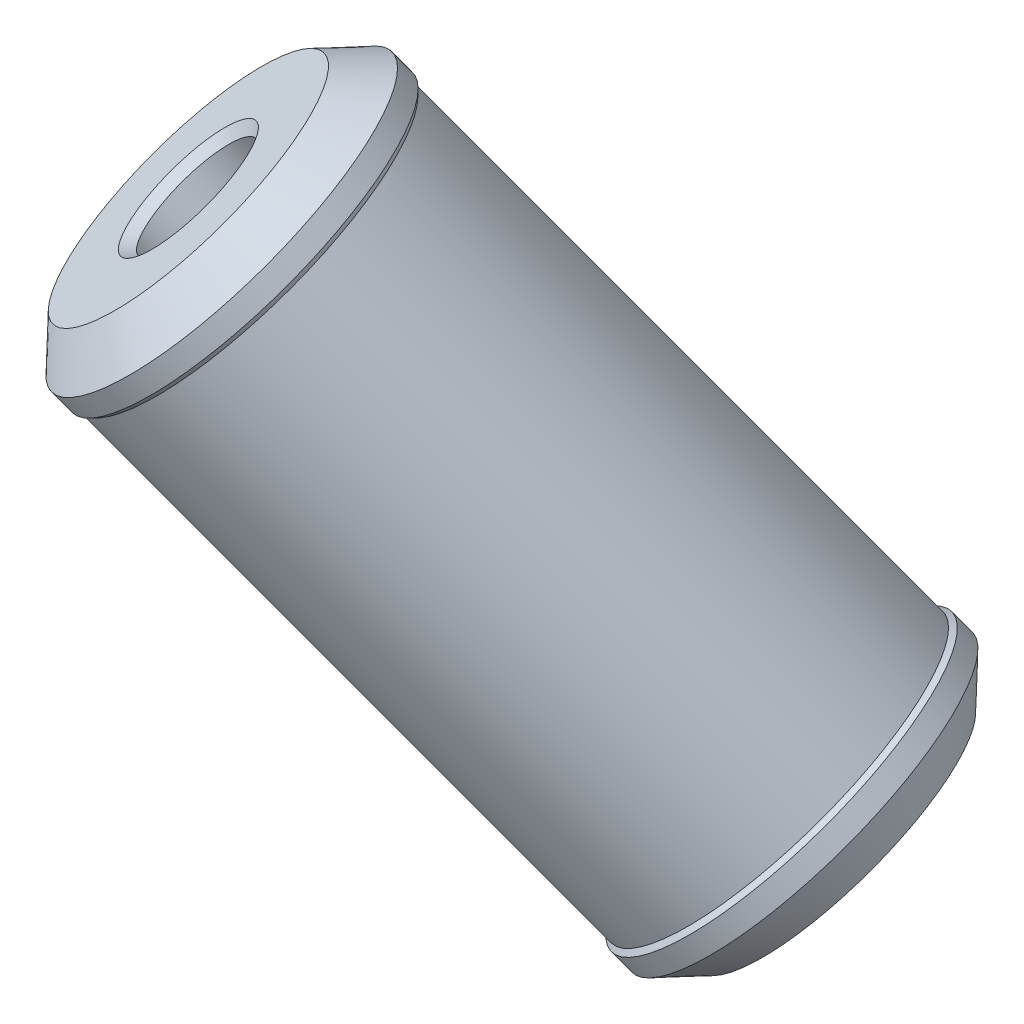
ISO-10303-21;
HEADER;
FILE_DESCRIPTION(('STEP AP214'),'2;1');
FILE_NAME('part.step','',(''),(''),'','','');
FILE_SCHEMA(('AUTOMOTIVE_DESIGN { 1 0 10303 214 1 1 1 1 }'));
ENDSEC;
DATA;
#1=APPLICATION_CONTEXT('core data for automotive mechanical design processes');
#2=APPLICATION_PROTOCOL_DEFINITION('international standard','automotive_design',2000,#1);
#3=PRODUCT_CONTEXT('',#1,'mechanical');
#4=PRODUCT('Part','Part','',(#3));
#5=PRODUCT_RELATED_PRODUCT_CATEGORY('part','',(#4));
#6=PRODUCT_DEFINITION_FORMATION('','',#4);
#7=PRODUCT_DEFINITION_CONTEXT('part definition',#1,'design');
#8=PRODUCT_DEFINITION('design','',#6,#7);
#9=PRODUCT_DEFINITION_SHAPE('','',#8);
#10=(LENGTH_UNIT() NAMED_UNIT(*) SI_UNIT(.MILLI.,.METRE.));
#11=(NAMED_UNIT(*) PLANE_ANGLE_UNIT() SI_UNIT($,.RADIAN.));
#12=(NAMED_UNIT(*) SI_UNIT($,.STERADIAN.) SOLID_ANGLE_UNIT());
#13=UNCERTAINTY_MEASURE_WITH_UNIT(LENGTH_MEASURE(1.E-05),#10,'distance_accuracy_value','');
#14=(GEOMETRIC_REPRESENTATION_CONTEXT(3) GLOBAL_UNCERTAINTY_ASSIGNED_CONTEXT((#13)) GLOBAL_UNIT_ASSIGNED_CONTEXT((#10,
#11,#12)) REPRESENTATION_CONTEXT('',''));
#15=CARTESIAN_POINT('',(0.,0.,0.));
#16=DIRECTION('',(0.,0.,1.));
#17=DIRECTION('',(1.,0.,0.));
#18=AXIS2_PLACEMENT_3D('',#15,#16,#17);
#19=CARTESIAN_POINT('',(-2.64501130833047,-7.85772410593551,-20.2967421844936));
#20=DIRECTION('',(0.612372435695795,-0.707106781186548,-0.353553390593274));
#21=DIRECTION('',(0.612372435695795,0.707106781186548,-0.353553390593274));
#22=AXIS2_PLACEMENT_3D('',#19,#20,#21);
#23=CONICAL_SURFACE('',#22,2.25,0.785398163397453);
#24=CARTESIAN_POINT('',(-2.82872303903921,-7.64559207157955,-20.1906761673156));
#25=DIRECTION('',(0.612372435695795,-0.707106781186548,-0.353553390593274));
#26=DIRECTION('',(0.755928946018454,0.654653670707977,0.));
#27=AXIS2_PLACEMENT_3D('',#24,#25,#26);
#28=CIRCLE('',#27,1.95);
#29=CARTESIAN_POINT('',(-1.35466159430322,-6.36901741369899,-20.1906761673156));
#30=VERTEX_POINT('',#29);
#31=EDGE_CURVE('E119',#30,#30,#28,.F.);
#32=ORIENTED_EDGE('',*,*,#31,.T.);
#33=EDGE_LOOP('',(#32));
#34=FACE_BOUND('',#33,.T.);
#35=CARTESIAN_POINT('',(-2.64501130833046,-7.85772410593551,-20.2967421844936));
#36=DIRECTION('',(-0.612372435695795,0.707106781186548,0.353553390593274));
#37=DIRECTION('',(-0.612372435695795,-0.707106781186548,0.353553390593274));
#38=AXIS2_PLACEMENT_3D('',#35,#36,#37);
#39=CIRCLE('',#38,2.25);
#40=CARTESIAN_POINT('',(-4.022849288646,-9.44871436360524,-19.5012470556588));
#41=VERTEX_POINT('',#40);
#42=EDGE_CURVE('E86',#41,#41,#39,.T.);
#43=ORIENTED_EDGE('',*,*,#42,.F.);
#44=EDGE_LOOP('',(#43));
#45=FACE_BOUND('',#44,.T.);
#46=ADVANCED_FACE('F60',(#34,#45),#23,.F.);
#47=CARTESIAN_POINT('',(-15.9488024738216,7.50417071534223,-12.6157947738548));
#48=DIRECTION('',(-0.612372435695795,0.707106781186548,0.353553390593274));
#49=DIRECTION('',(-0.612372435695795,-0.707106781186548,0.353553390593274));
#50=AXIS2_PLACEMENT_3D('',#47,#48,#49);
#51=CONICAL_SURFACE('',#50,1.75,0.785398163397446);
#52=CARTESIAN_POINT('',(-16.0712769609608,7.64559207157954,-12.5450840957361));
#53=DIRECTION('',(-0.612372435695795,0.707106781186548,0.353553390593274));
#54=DIRECTION('',(-0.755928946018454,-0.654653670707977,0.));
#55=AXIS2_PLACEMENT_3D('',#52,#53,#54);
#56=CIRCLE('',#55,1.95);
#57=CARTESIAN_POINT('',(-17.5453384056967,6.36901741369898,-12.5450840957361));
#58=VERTEX_POINT('',#57);
#59=EDGE_CURVE('E115',#58,#58,#56,.F.);
#60=ORIENTED_EDGE('',*,*,#59,.T.);
#61=EDGE_LOOP('',(#60));
#62=FACE_BOUND('',#61,.T.);
#63=CARTESIAN_POINT('',(-16.2549886916695,7.85772410593551,-12.4390180785581));
#64=DIRECTION('',(0.612372435695795,-0.707106781186548,-0.353553390593274));
#65=DIRECTION('',(-0.612372435695795,-0.707106781186548,0.353553390593274));
#66=AXIS2_PLACEMENT_3D('',#63,#64,#65);
#67=CIRCLE('',#66,2.25);
#68=CARTESIAN_POINT('',(-17.632826671985,6.26673384826578,-11.6435229497233));
#69=VERTEX_POINT('',#68);
#70=EDGE_CURVE('E97',#69,#69,#67,.T.);
#71=ORIENTED_EDGE('',*,*,#70,.F.);
#72=EDGE_LOOP('',(#71));
#73=FACE_BOUND('',#72,.T.);
#74=ADVANCED_FACE('F144',(#62,#73),#51,.F.);
#75=CARTESIAN_POINT('',(-3.86975617972206,-6.44351054356241,-19.5896354033071));
#76=DIRECTION('',(-0.612372435695795,0.707106781186548,0.353553390593273));
#77=DIRECTION('',(-0.612372435695795,-0.707106781186547,0.353553390593274));
#78=AXIS2_PLACEMENT_3D('',#75,#76,#77);
#79=CONICAL_SURFACE('',#78,6.5,0.785398163397449);
#80=CARTESIAN_POINT('',(-3.34706361092806,-7.04706393415568,-19.8914120986037));
#81=DIRECTION('',(0.612372435695795,-0.707106781186546,-0.353553390593277));
#82=DIRECTION('',(0.755928946018454,0.654653670707978,0.));
#83=AXIS2_PLACEMENT_3D('',#80,#81,#82);
#84=CIRCLE('',#83,5.64644660940673);
#85=CARTESIAN_POINT('',(0.921248823270245,-3.35059693485094,-19.8914120986037));
#86=VERTEX_POINT('',#85);
#87=EDGE_CURVE('E120',#86,#86,#84,.T.);
#88=ORIENTED_EDGE('',*,*,#87,.T.);
#89=EDGE_LOOP('',(#88));
#90=FACE_BOUND('',#89,.T.);
#91=CARTESIAN_POINT('',(-2.64501130833046,-7.85772410593551,-20.2967421844936));
#92=DIRECTION('',(0.612372435695795,-0.707106781186548,-0.353553390593274));
#93=DIRECTION('',(-0.612372435695795,-0.707106781186548,0.353553390593274));
#94=AXIS2_PLACEMENT_3D('',#91,#92,#93);
#95=CIRCLE('',#94,4.5);
#96=CARTESIAN_POINT('',(-5.40068726896154,-11.039704621275,-18.7057519268239));
#97=VERTEX_POINT('',#96);
#98=EDGE_CURVE('E79',#97,#97,#95,.T.);
#99=ORIENTED_EDGE('',*,*,#98,.F.);
#100=EDGE_LOOP('',(#99));
#101=FACE_BOUND('',#100,.T.);
#102=ADVANCED_FACE('F151',(#90,#101),#79,.T.);
#103=CARTESIAN_POINT('',(-16.2549886916695,7.85772410593551,-12.4390180785581));
#104=DIRECTION('',(0.612372435695795,-0.707106781186548,-0.353553390593274));
#105=DIRECTION('',(0.612372435695795,0.707106781186548,-0.353553390593274));
#106=AXIS2_PLACEMENT_3D('',#103,#104,#105);
#107=CONICAL_SURFACE('',#106,4.5,0.785398163397448);
#108=CARTESIAN_POINT('',(-15.5529363890719,7.04706393415569,-12.844348164448));
#109=DIRECTION('',(-0.612372435695792,0.707106781186549,0.353553390593275));
#110=DIRECTION('',(-0.755928946018456,-0.654653670707975,0.));
#111=AXIS2_PLACEMENT_3D('',#108,#109,#110);
#112=CIRCLE('',#111,5.64644660940672);
#113=CARTESIAN_POINT('',(-19.8212488232702,3.35059693485097,-12.844348164448));
#114=VERTEX_POINT('',#113);
#115=EDGE_CURVE('E70',#114,#114,#112,.T.);
#116=ORIENTED_EDGE('',*,*,#115,.T.);
#117=EDGE_LOOP('',(#116));
#118=FACE_BOUND('',#117,.T.);
#119=CARTESIAN_POINT('',(-16.2549886916695,7.85772410593551,-12.4390180785581));
#120=DIRECTION('',(-0.612372435695795,0.707106781186548,0.353553390593274));
#121=DIRECTION('',(-0.612372435695795,-0.707106781186548,0.353553390593274));
#122=AXIS2_PLACEMENT_3D('',#119,#120,#121);
#123=CIRCLE('',#122,4.5);
#124=CARTESIAN_POINT('',(-19.0106646523006,4.67574359059604,-10.8480278208884));
#125=VERTEX_POINT('',#124);
#126=EDGE_CURVE('E101',#125,#125,#123,.T.);
#127=ORIENTED_EDGE('',*,*,#126,.F.);
#128=EDGE_LOOP('',(#127));
#129=FACE_BOUND('',#128,.T.);
#130=ADVANCED_FACE('F131',(#118,#129),#107,.T.);
#131=CARTESIAN_POINT('',(-2.64501130833046,-7.85772410593551,-20.2967421844936));
#132=DIRECTION('',(-0.612372435695795,0.707106781186548,0.353553390593274));
#133=DIRECTION('',(0.5,0.,0.866025403784439));
#134=AXIS2_PLACEMENT_3D('',#131,#132,#133);
#135=PLANE('',#134);
#136=ORIENTED_EDGE('',*,*,#98,.T.);
#137=EDGE_LOOP('',(#136));
#138=FACE_BOUND('',#137,.T.);
#139=ORIENTED_EDGE('',*,*,#42,.T.);
#140=EDGE_LOOP('',(#139));
#141=FACE_BOUND('',#140,.T.);
#142=ADVANCED_FACE('F210',(#138,#141),#135,.F.);
#143=CARTESIAN_POINT('',(-16.2549886916695,7.85772410593551,-12.4390180785581));
#144=DIRECTION('',(-0.612372435695795,0.707106781186548,0.353553390593274));
#145=DIRECTION('',(0.5,0.,0.866025403784439));
#146=AXIS2_PLACEMENT_3D('',#143,#144,#145);
#147=PLANE('',#146);
#148=ORIENTED_EDGE('',*,*,#126,.T.);
#149=EDGE_LOOP('',(#148));
#150=FACE_BOUND('',#149,.T.);
#151=ORIENTED_EDGE('',*,*,#70,.T.);
#152=EDGE_LOOP('',(#151));
#153=FACE_BOUND('',#152,.T.);
#154=ADVANCED_FACE('F98',(#150,#153),#147,.T.);
#155=CARTESIAN_POINT('',(8.61331894086729,-20.8577241059356,-26.7967421844937));
#156=DIRECTION('',(-0.612372435695794,0.707106781186547,0.353553390593274));
#157=DIRECTION('',(-0.755928946018454,-0.654653670707977,0.));
#158=AXIS2_PLACEMENT_3D('',#155,#156,#157);
#159=CYLINDRICAL_SURFACE('',#158,5.50000000000001);
#160=CARTESIAN_POINT('',(-3.86975617972207,-6.4435105435624,-19.5896354033071));
#161=DIRECTION('',(-0.612372435695795,0.707106781186548,0.353553390593274));
#162=DIRECTION('',(-0.755928946018454,-0.654653670707977,0.));
#163=AXIS2_PLACEMENT_3D('',#160,#161,#162);
#164=CIRCLE('',#163,5.50000000000001);
#165=CARTESIAN_POINT('',(-8.02736538282358,-10.0441057324563,-19.5896354033071));
#166=VERTEX_POINT('',#165);
#167=EDGE_CURVE('E102',#166,#166,#164,.F.);
#168=ORIENTED_EDGE('',*,*,#167,.F.);
#169=EDGE_LOOP('',(#168));
#170=FACE_BOUND('',#169,.T.);
#171=CARTESIAN_POINT('',(-15.0302438202779,6.44351054356243,-13.1461248597447));
#172=DIRECTION('',(-0.612372435695795,0.707106781186548,0.353553390593274));
#173=DIRECTION('',(-0.755928946018454,-0.654653670707977,0.));
#174=AXIS2_PLACEMENT_3D('',#171,#172,#173);
#175=CIRCLE('',#174,5.50000000000001);
#176=CARTESIAN_POINT('',(-19.1878530233794,2.84291535466855,-13.1461248597447));
#177=VERTEX_POINT('',#176);
#178=EDGE_CURVE('E109',#177,#177,#175,.T.);
#179=ORIENTED_EDGE('',*,*,#178,.F.);
#180=EDGE_LOOP('',(#179));
#181=FACE_BOUND('',#180,.T.);
#182=ADVANCED_FACE('F209',(#170,#181),#159,.T.);
#183=CARTESIAN_POINT('',(1.3638676398185,-12.4867787856604,-22.6112695243561));
#184=DIRECTION('',(-0.612372435695794,0.707106781186548,0.353553390593274));
#185=DIRECTION('',(-0.755928946018455,-0.654653670707977,0.));
#186=AXIS2_PLACEMENT_3D('',#183,#184,#185);
#187=CYLINDRICAL_SURFACE('',#186,1.95);
#188=ORIENTED_EDGE('',*,*,#59,.F.);
#189=EDGE_LOOP('',(#188));
#190=FACE_BOUND('',#189,.T.);
#191=ORIENTED_EDGE('',*,*,#31,.F.);
#192=EDGE_LOOP('',(#191));
#193=FACE_BOUND('',#192,.T.);
#194=ADVANCED_FACE('F166',(#190,#193),#187,.F.);
#195=CARTESIAN_POINT('',(-3.56356996187417,-6.79706393415567,-19.7664120986037));
#196=DIRECTION('',(0.612372435695795,-0.707106781186546,-0.353553390593277));
#197=DIRECTION('',(0.755928946018454,0.654653670707978,0.));
#198=AXIS2_PLACEMENT_3D('',#195,#196,#197);
#199=CONICAL_SURFACE('',#198,6.00000000000002,0.785398163397444);
#200=CARTESIAN_POINT('',(-3.78007631282029,-6.54706393415566,-19.6414120986037));
#201=DIRECTION('',(-0.612372435695795,0.707106781186546,0.353553390593277));
#202=DIRECTION('',(-0.755928946018454,-0.654653670707978,0.));
#203=AXIS2_PLACEMENT_3D('',#200,#201,#202);
#204=CIRCLE('',#203,5.64644660940673);
#205=CARTESIAN_POINT('',(-8.04838874701859,-10.2435309334604,-19.6414120986037));
#206=VERTEX_POINT('',#205);
#207=EDGE_CURVE('E124',#206,#206,#204,.T.);
#208=ORIENTED_EDGE('',*,*,#207,.T.);
#209=EDGE_LOOP('',(#208));
#210=FACE_BOUND('',#209,.T.);
#211=ORIENTED_EDGE('',*,*,#167,.T.);
#212=EDGE_LOOP('',(#211));
#213=FACE_BOUND('',#212,.T.);
#214=ADVANCED_FACE('F160',(#210,#213),#199,.T.);
#215=CARTESIAN_POINT('',(-15.3364300381258,6.79706393415569,-12.969348164448));
#216=DIRECTION('',(-0.612372435695792,0.707106781186549,0.353553390593275));
#217=DIRECTION('',(-0.755928946018456,-0.654653670707975,0.));
#218=AXIS2_PLACEMENT_3D('',#215,#216,#217);
#219=CONICAL_SURFACE('',#218,6.00000000000001,0.785398163397442);
#220=CARTESIAN_POINT('',(-15.1199236871797,6.54706393415568,-13.094348164448));
#221=DIRECTION('',(0.612372435695792,-0.707106781186549,-0.353553390593275));
#222=DIRECTION('',(0.755928946018456,0.654653670707975,0.));
#223=AXIS2_PLACEMENT_3D('',#220,#221,#222);
#224=CIRCLE('',#223,5.64644660940673);
#225=CARTESIAN_POINT('',(-19.388236121378,2.85059693485096,-13.094348164448));
#226=VERTEX_POINT('',#225);
#227=EDGE_CURVE('E12',#226,#226,#224,.T.);
#228=ORIENTED_EDGE('',*,*,#227,.T.);
#229=EDGE_LOOP('',(#228));
#230=FACE_BOUND('',#229,.T.);
#231=ORIENTED_EDGE('',*,*,#178,.T.);
#232=EDGE_LOOP('',(#231));
#233=FACE_BOUND('',#232,.T.);
#234=ADVANCED_FACE('F140',(#230,#233),#219,.T.);
#235=CARTESIAN_POINT('',(-3.34706361092806,-7.04706393415568,-19.8914120986037));
#236=DIRECTION('',(0.612372435695795,-0.707106781186546,-0.353553390593277));
#237=DIRECTION('',(0.755928946018454,0.654653670707978,0.));
#238=AXIS2_PLACEMENT_3D('',#235,#236,#237);
#239=CYLINDRICAL_SURFACE('',#238,5.64644660940674);
#240=ORIENTED_EDGE('',*,*,#207,.F.);
#241=EDGE_LOOP('',(#240));
#242=FACE_BOUND('',#241,.T.);
#243=ORIENTED_EDGE('',*,*,#87,.F.);
#244=EDGE_LOOP('',(#243));
#245=FACE_BOUND('',#244,.T.);
#246=ADVANCED_FACE('F135',(#242,#245),#239,.T.);
#247=CARTESIAN_POINT('',(-15.5529363890719,7.04706393415568,-12.844348164448));
#248=DIRECTION('',(-0.612372435695792,0.707106781186549,0.353553390593275));
#249=DIRECTION('',(-0.755928946018456,-0.654653670707975,0.));
#250=AXIS2_PLACEMENT_3D('',#247,#248,#249);
#251=CYLINDRICAL_SURFACE('',#250,5.64644660940673);
#252=CARTESIAN_POINT('',(-19.388236121378,2.85059693485096,-13.094348164448));
#253=CARTESIAN_POINT('',(-19.3927466703561,2.8558052681843,-13.0917439977813));
#254=CARTESIAN_POINT('',(-19.3972572193341,2.86101360151763,-13.0891398311147));
#255=CARTESIAN_POINT('',(-19.4062783172902,2.8714302681843,-13.0839314977813));
#256=CARTESIAN_POINT('',(-19.4107888662682,2.87663860151763,-13.0813273311147));
#257=CARTESIAN_POINT('',(-19.4198099642243,2.8870552681843,-13.0761189977814));
#258=CARTESIAN_POINT('',(-19.4243205132024,2.89226360151763,-13.0735148311147));
#259=CARTESIAN_POINT('',(-19.4333416111584,2.9026802681843,-13.0683064977813));
#260=CARTESIAN_POINT('',(-19.4378521601365,2.90788860151763,-13.0657023311147));
#261=CARTESIAN_POINT('',(-19.4468732580926,2.9183052681843,-13.0604939977813));
#262=CARTESIAN_POINT('',(-19.4513838070706,2.92351360151763,-13.0578898311147));
#263=CARTESIAN_POINT('',(-19.4604049050267,2.9339302681843,-13.0526814977813));
#264=CARTESIAN_POINT('',(-19.4649154540048,2.93913860151763,-13.0500773311147));
#265=CARTESIAN_POINT('',(-19.4739365519608,2.9495552681843,-13.0448689977813));
#266=CARTESIAN_POINT('',(-19.4784471009389,2.95476360151763,-13.0422648311147));
#267=CARTESIAN_POINT('',(-19.487468198895,2.9651802681843,-13.0370564977813));
#268=CARTESIAN_POINT('',(-19.491978747873,2.97038860151763,-13.0344523311147));
#269=CARTESIAN_POINT('',(-19.5009998458291,2.9808052681843,-13.0292439977813));
#270=CARTESIAN_POINT('',(-19.5055103948072,2.98601360151763,-13.0266398311147));
#271=CARTESIAN_POINT('',(-19.5145314927632,2.9964302681843,-13.0214314977813));
#272=CARTESIAN_POINT('',(-19.5190420417413,3.00163860151763,-13.0188273311147));
#273=CARTESIAN_POINT('',(-19.5280631396974,3.0120552681843,-13.0136189977813));
#274=CARTESIAN_POINT('',(-19.5325736886754,3.01726360151763,-13.0110148311147));
#275=CARTESIAN_POINT('',(-19.5415947866315,3.0276802681843,-13.0058064977813));
#276=CARTESIAN_POINT('',(-19.5461053356095,3.03288860151763,-13.0032023311147));
#277=CARTESIAN_POINT('',(-19.5551264335656,3.0433052681843,-12.9979939977813));
#278=CARTESIAN_POINT('',(-19.5596369825437,3.04851360151763,-12.9953898311147));
#279=CARTESIAN_POINT('',(-19.5686580804998,3.0589302681843,-12.9901814977813));
#280=CARTESIAN_POINT('',(-19.5731686294778,3.06413860151763,-12.9875773311147));
#281=CARTESIAN_POINT('',(-19.5821897274339,3.0745552681843,-12.9823689977813));
#282=CARTESIAN_POINT('',(-19.5867002764119,3.07976360151764,-12.9797648311147));
#283=CARTESIAN_POINT('',(-19.595721374368,3.0901802681843,-12.9745564977813));
#284=CARTESIAN_POINT('',(-19.6002319233461,3.09538860151763,-12.9719523311147));
#285=CARTESIAN_POINT('',(-19.6092530213022,3.1058052681843,-12.9667439977813));
#286=CARTESIAN_POINT('',(-19.6137635702802,3.11101360151764,-12.9641398311147));
#287=CARTESIAN_POINT('',(-19.6227846682363,3.1214302681843,-12.9589314977813));
#288=CARTESIAN_POINT('',(-19.6272952172143,3.12663860151764,-12.9563273311147));
#289=CARTESIAN_POINT('',(-19.6363163151704,3.1370552681843,-12.9511189977813));
#290=CARTESIAN_POINT('',(-19.6408268641485,3.14226360151764,-12.9485148311147));
#291=CARTESIAN_POINT('',(-19.6498479621046,3.1526802681843,-12.9433064977813));
#292=CARTESIAN_POINT('',(-19.6543585110826,3.15788860151764,-12.9407023311147));
#293=CARTESIAN_POINT('',(-19.6633796090387,3.1683052681843,-12.9354939977813));
#294=CARTESIAN_POINT('',(-19.6678901580167,3.17351360151764,-12.9328898311147));
#295=CARTESIAN_POINT('',(-19.6769112559728,3.1839302681843,-12.9276814977813));
#296=CARTESIAN_POINT('',(-19.6814218049509,3.18913860151764,-12.9250773311147));
#297=CARTESIAN_POINT('',(-19.690442902907,3.1995552681843,-12.9198689977813));
#298=CARTESIAN_POINT('',(-19.694953451885,3.20476360151764,-12.9172648311147));
#299=CARTESIAN_POINT('',(-19.7039745498411,3.2151802681843,-12.9120564977813));
#300=CARTESIAN_POINT('',(-19.7084850988191,3.22038860151764,-12.9094523311147));
#301=CARTESIAN_POINT('',(-19.7175061967752,3.2308052681843,-12.9042439977813));
#302=CARTESIAN_POINT('',(-19.7220167457533,3.23601360151764,-12.9016398311147));
#303=CARTESIAN_POINT('',(-19.7310378437094,3.2464302681843,-12.8964314977813));
#304=CARTESIAN_POINT('',(-19.7355483926874,3.25163860151764,-12.8938273311147));
#305=CARTESIAN_POINT('',(-19.7445694906435,3.2620552681843,-12.8886189977813));
#306=CARTESIAN_POINT('',(-19.7490800396215,3.26726360151764,-12.8860148311147));
#307=CARTESIAN_POINT('',(-19.7581011375776,3.2776802681843,-12.8808064977813));
#308=CARTESIAN_POINT('',(-19.7626116865557,3.28288860151764,-12.8782023311147));
#309=CARTESIAN_POINT('',(-19.7716327845117,3.2933052681843,-12.8729939977813));
#310=CARTESIAN_POINT('',(-19.7761433334898,3.29851360151764,-12.8703898311147));
#311=CARTESIAN_POINT('',(-19.7851644314459,3.30893026818431,-12.8651814977813));
#312=CARTESIAN_POINT('',(-19.7896749804239,3.31413860151764,-12.8625773311147));
#313=CARTESIAN_POINT('',(-19.79869607838,3.32455526818431,-12.8573689977813));
#314=CARTESIAN_POINT('',(-19.8032066273581,3.32976360151764,-12.8547648311147));
#315=CARTESIAN_POINT('',(-19.8122277253141,3.34018026818431,-12.8495564977813));
#316=CARTESIAN_POINT('',(-19.8167382742922,3.34538860151764,-12.8469523311147));
#317=CARTESIAN_POINT('',(-19.8212488232702,3.35059693485097,-12.844348164448));
#318=B_SPLINE_CURVE_WITH_KNOTS('',3,(#252,#253,#254,#255,#256,#257,#258,#259,#260,#261,#262,
#263,#264,#265,#266,#267,#268,#269,#270,#271,#272,#273,#274,#275,#276,#277,#278,#279,#280,#281,
#282,#283,#284,#285,#286,#287,#288,#289,#290,#291,#292,#293,#294,#295,#296,#297,#298,#299,#300,
#301,#302,#303,#304,#305,#306,#307,#308,#309,#310,#311,#312,#313,#314,#315,#316,#317),
.UNSPECIFIED.,.F.,.F.,(4,2,2,2,2,2,2,2,2,2,2,2,2,2,2,2,2,2,2,2,2,2,2,2,2,2,2,2,2,2,2,2,4),(0.,
0.02209708691208,0.0441941738241593,0.0662912607362396,0.0883883476483199,0.110485434560399,
0.13258252147248,0.154679608384559,0.176776695296639,0.198873782208719,0.220970869120799,
0.243067956032879,0.265165042944958,0.287262129857038,0.309359216769118,0.331456303681198,
0.353553390593278,0.375650477505358,0.397747564417438,0.419844651329518,0.441941738241598,
0.464038825153677,0.486135912065757,0.50823299897784,0.530330085889919,0.552427172801999,
0.574524259714079,0.596621346626159,0.618718433538239,0.640815520450318,0.662912607362399,
0.685009694274478,0.707106781186558),.UNSPECIFIED.);
#319=EDGE_CURVE('BSEAM63',#226,#114,#318,.T.);
#320=ORIENTED_EDGE('',*,*,#227,.F.);
#321=ORIENTED_EDGE('',*,*,#115,.F.);
#322=ORIENTED_EDGE('',*,*,#319,.T.);
#323=ORIENTED_EDGE('',*,*,#319,.F.);
#324=EDGE_LOOP('',(#320,#322,#321,#323));
#325=FACE_BOUND('',#324,.T.);
#326=ADVANCED_FACE('F63',(#325),#251,.T.);
#327=CLOSED_SHELL('',(#46,#74,#102,#130,#142,#154,#182,#194,#214,#234,#246,#326));
#328=MANIFOLD_SOLID_BREP('B2',#327);
#329=ADVANCED_BREP_SHAPE_REPRESENTATION('',(#18,#328),#14);
#330=SHAPE_DEFINITION_REPRESENTATION(#9,#329);
ENDSEC;
END-ISO-10303-21;
